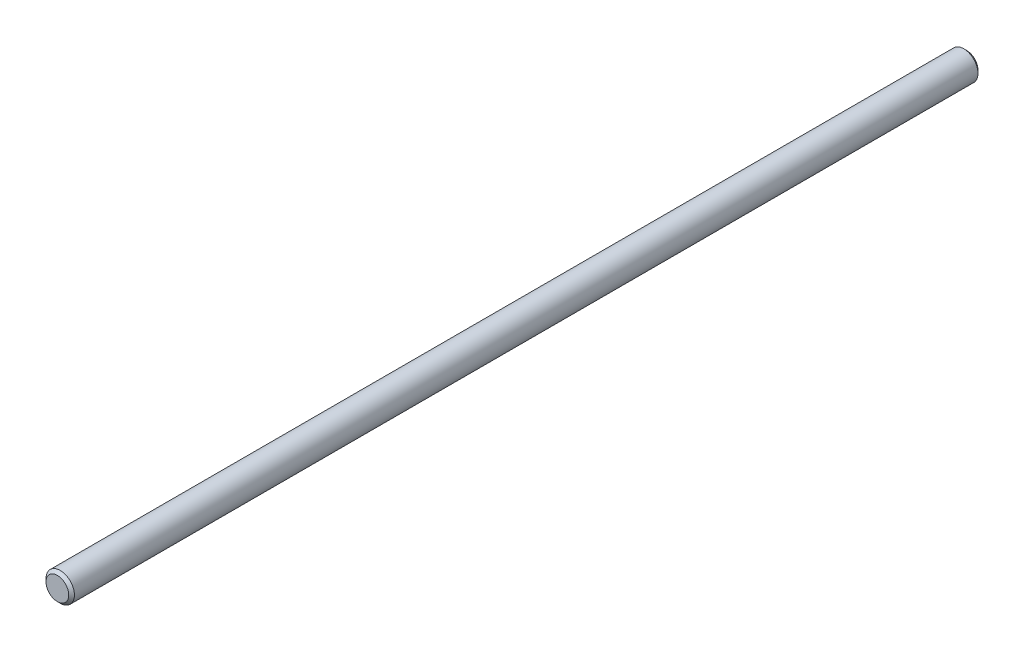
ISO-10303-21;
HEADER;
FILE_DESCRIPTION(('STEP AP214'),'2;1');
FILE_NAME('part.step','',(''),(''),'','','');
FILE_SCHEMA(('AUTOMOTIVE_DESIGN { 1 0 10303 214 1 1 1 1 }'));
ENDSEC;
DATA;
#1=APPLICATION_CONTEXT('core data for automotive mechanical design processes');
#2=APPLICATION_PROTOCOL_DEFINITION('international standard','automotive_design',2000,#1);
#3=PRODUCT_CONTEXT('',#1,'mechanical');
#4=PRODUCT('Part','Part','',(#3));
#5=PRODUCT_RELATED_PRODUCT_CATEGORY('part','',(#4));
#6=PRODUCT_DEFINITION_FORMATION('','',#4);
#7=PRODUCT_DEFINITION_CONTEXT('part definition',#1,'design');
#8=PRODUCT_DEFINITION('design','',#6,#7);
#9=PRODUCT_DEFINITION_SHAPE('','',#8);
#10=(LENGTH_UNIT() NAMED_UNIT(*) SI_UNIT(.MILLI.,.METRE.));
#11=(NAMED_UNIT(*) PLANE_ANGLE_UNIT() SI_UNIT($,.RADIAN.));
#12=(NAMED_UNIT(*) SI_UNIT($,.STERADIAN.) SOLID_ANGLE_UNIT());
#13=UNCERTAINTY_MEASURE_WITH_UNIT(LENGTH_MEASURE(1.E-05),#10,'distance_accuracy_value','');
#14=(GEOMETRIC_REPRESENTATION_CONTEXT(3) GLOBAL_UNCERTAINTY_ASSIGNED_CONTEXT((#13)) GLOBAL_UNIT_ASSIGNED_CONTEXT((#10,
#11,#12)) REPRESENTATION_CONTEXT('',''));
#15=CARTESIAN_POINT('',(0.,0.,0.));
#16=DIRECTION('',(0.,0.,1.));
#17=DIRECTION('',(1.,0.,0.));
#18=AXIS2_PLACEMENT_3D('',#15,#16,#17);
#19=CARTESIAN_POINT('',(0.,0.,152.4));
#20=DIRECTION('',(0.,0.,-1.));
#21=DIRECTION('',(-1.,0.,0.));
#22=AXIS2_PLACEMENT_3D('',#19,#20,#21);
#23=CYLINDRICAL_SURFACE('',#22,4.7625);
#24=CARTESIAN_POINT('',(0.,0.,-151.4475));
#25=DIRECTION('',(0.,0.,1.));
#26=DIRECTION('',(1.,0.,0.));
#27=AXIS2_PLACEMENT_3D('',#24,#25,#26);
#28=CIRCLE('',#27,4.7625);
#29=CARTESIAN_POINT('',(-4.7625,0.,-151.4475));
#30=VERTEX_POINT('',#29);
#31=EDGE_CURVE('E41',#30,#30,#28,.T.);
#32=CARTESIAN_POINT('',(0.,0.,151.4475));
#33=DIRECTION('',(0.,0.,1.));
#34=DIRECTION('',(1.,0.,0.));
#35=AXIS2_PLACEMENT_3D('',#32,#33,#34);
#36=CIRCLE('',#35,4.7625);
#37=CARTESIAN_POINT('',(-4.7625,0.,151.4475));
#38=VERTEX_POINT('',#37);
#39=EDGE_CURVE('E45',#38,#38,#36,.F.);
#40=CARTESIAN_POINT('',(-4.7625,0.,-151.4475));
#41=CARTESIAN_POINT('',(-4.7625,0.,-148.29234375));
#42=CARTESIAN_POINT('',(-4.7625,0.,-145.1371875));
#43=CARTESIAN_POINT('',(-4.7625,0.,-138.826875));
#44=CARTESIAN_POINT('',(-4.7625,0.,-135.67171875));
#45=CARTESIAN_POINT('',(-4.7625,0.,-129.36140625));
#46=CARTESIAN_POINT('',(-4.7625,0.,-126.20625));
#47=CARTESIAN_POINT('',(-4.7625,0.,-119.8959375));
#48=CARTESIAN_POINT('',(-4.7625,0.,-116.74078125));
#49=CARTESIAN_POINT('',(-4.7625,0.,-110.43046875));
#50=CARTESIAN_POINT('',(-4.7625,0.,-107.2753125));
#51=CARTESIAN_POINT('',(-4.7625,0.,-100.965));
#52=CARTESIAN_POINT('',(-4.7625,0.,-97.8098437499998));
#53=CARTESIAN_POINT('',(-4.7625,0.,-91.4995312499998));
#54=CARTESIAN_POINT('',(-4.7625,0.,-88.3443749999998));
#55=CARTESIAN_POINT('',(-4.7625,0.,-82.0340624999998));
#56=CARTESIAN_POINT('',(-4.7625,0.,-78.8789062499998));
#57=CARTESIAN_POINT('',(-4.7625,0.,-72.5685937499998));
#58=CARTESIAN_POINT('',(-4.7625,0.,-69.4134374999998));
#59=CARTESIAN_POINT('',(-4.7625,0.,-63.1031249999998));
#60=CARTESIAN_POINT('',(-4.7625,0.,-59.9479687499998));
#61=CARTESIAN_POINT('',(-4.7625,0.,-53.6376562499998));
#62=CARTESIAN_POINT('',(-4.7625,0.,-50.4824999999998));
#63=CARTESIAN_POINT('',(-4.7625,0.,-44.1721874999998));
#64=CARTESIAN_POINT('',(-4.7625,0.,-41.0170312499998));
#65=CARTESIAN_POINT('',(-4.7625,0.,-34.7067187499998));
#66=CARTESIAN_POINT('',(-4.7625,0.,-31.5515624999998));
#67=CARTESIAN_POINT('',(-4.7625,0.,-25.2412499999998));
#68=CARTESIAN_POINT('',(-4.7625,0.,-22.0860937499998));
#69=CARTESIAN_POINT('',(-4.7625,0.,-15.7757812499998));
#70=CARTESIAN_POINT('',(-4.7625,0.,-12.6206249999998));
#71=CARTESIAN_POINT('',(-4.7625,0.,-6.31031249999982));
#72=CARTESIAN_POINT('',(-4.7625,0.,-3.15515624999983));
#73=CARTESIAN_POINT('',(-4.7625,0.,3.15515625000016));
#74=CARTESIAN_POINT('',(-4.7625,0.,6.31031250000016));
#75=CARTESIAN_POINT('',(-4.7625,0.,12.6206250000002));
#76=CARTESIAN_POINT('',(-4.7625,0.,15.7757812500002));
#77=CARTESIAN_POINT('',(-4.7625,0.,22.0860937500002));
#78=CARTESIAN_POINT('',(-4.7625,0.,25.2412500000002));
#79=CARTESIAN_POINT('',(-4.7625,0.,31.5515625000002));
#80=CARTESIAN_POINT('',(-4.7625,0.,34.7067187500001));
#81=CARTESIAN_POINT('',(-4.7625,0.,41.0170312500001));
#82=CARTESIAN_POINT('',(-4.7625,0.,44.1721875000001));
#83=CARTESIAN_POINT('',(-4.7625,0.,50.4825000000001));
#84=CARTESIAN_POINT('',(-4.7625,0.,53.6376562500001));
#85=CARTESIAN_POINT('',(-4.7625,0.,59.9479687500001));
#86=CARTESIAN_POINT('',(-4.7625,0.,63.1031250000001));
#87=CARTESIAN_POINT('',(-4.7625,0.,69.4134375000001));
#88=CARTESIAN_POINT('',(-4.7625,0.,72.5685937500001));
#89=CARTESIAN_POINT('',(-4.7625,0.,78.8789062500001));
#90=CARTESIAN_POINT('',(-4.7625,0.,82.0340625000001));
#91=CARTESIAN_POINT('',(-4.7625,0.,88.3443750000001));
#92=CARTESIAN_POINT('',(-4.7625,0.,91.4995312500001));
#93=CARTESIAN_POINT('',(-4.7625,0.,97.8098437500001));
#94=CARTESIAN_POINT('',(-4.7625,0.,100.965));
#95=CARTESIAN_POINT('',(-4.7625,0.,107.2753125));
#96=CARTESIAN_POINT('',(-4.7625,0.,110.43046875));
#97=CARTESIAN_POINT('',(-4.7625,0.,116.74078125));
#98=CARTESIAN_POINT('',(-4.7625,0.,119.8959375));
#99=CARTESIAN_POINT('',(-4.7625,0.,126.20625));
#100=CARTESIAN_POINT('',(-4.7625,0.,129.36140625));
#101=CARTESIAN_POINT('',(-4.7625,0.,135.67171875));
#102=CARTESIAN_POINT('',(-4.7625,0.,138.826875));
#103=CARTESIAN_POINT('',(-4.7625,0.,145.1371875));
#104=CARTESIAN_POINT('',(-4.7625,0.,148.29234375));
#105=CARTESIAN_POINT('',(-4.7625,0.,151.4475));
#106=B_SPLINE_CURVE_WITH_KNOTS('',3,(#40,#41,#42,#43,#44,#45,#46,#47,#48,#49,#50,#51,#52,#53,
#54,#55,#56,#57,#58,#59,#60,#61,#62,#63,#64,#65,#66,#67,#68,#69,#70,#71,#72,#73,#74,#75,#76,#77,
#78,#79,#80,#81,#82,#83,#84,#85,#86,#87,#88,#89,#90,#91,#92,#93,#94,#95,#96,#97,#98,#99,#100,
#101,#102,#103,#104,#105),.UNSPECIFIED.,.F.,.F.,(4,2,2,2,2,2,2,2,2,2,2,2,2,2,2,2,2,2,2,2,2,2,2,
2,2,2,2,2,2,2,2,2,4),(0.,9.46546874999998,18.9309375,28.39640625,37.861875,47.32734375,
56.7928125,66.25828125,75.72375,85.1892187499999,94.6546875,104.12015625,113.585625,
123.05109375,132.5165625,141.98203125,151.4475,160.91296875,170.3784375,179.84390625,189.309375,
198.77484375,208.2403125,217.70578125,227.17125,236.63671875,246.1021875,255.56765625,
265.033125,274.49859375,283.9640625,293.42953125,302.895),.UNSPECIFIED.);
#107=EDGE_CURVE('BSEAM30',#30,#38,#106,.T.);
#108=ORIENTED_EDGE('',*,*,#31,.T.);
#109=ORIENTED_EDGE('',*,*,#39,.T.);
#110=ORIENTED_EDGE('',*,*,#107,.T.);
#111=ORIENTED_EDGE('',*,*,#107,.F.);
#112=EDGE_LOOP('',(#108,#110,#109,#111));
#113=FACE_BOUND('',#112,.T.);
#114=ADVANCED_FACE('F30',(#113),#23,.T.);
#115=CARTESIAN_POINT('',(0.,0.,152.4));
#116=DIRECTION('',(0.,0.,1.));
#117=DIRECTION('',(1.,0.,0.));
#118=AXIS2_PLACEMENT_3D('',#115,#116,#117);
#119=PLANE('',#118);
#120=CARTESIAN_POINT('',(0.,0.,152.4));
#121=DIRECTION('',(0.,0.,1.));
#122=DIRECTION('',(1.,0.,0.));
#123=AXIS2_PLACEMENT_3D('',#120,#121,#122);
#124=CIRCLE('',#123,3.81000000000012);
#125=CARTESIAN_POINT('',(3.81000000000012,0.,152.4));
#126=VERTEX_POINT('',#125);
#127=EDGE_CURVE('E10',#126,#126,#124,.T.);
#128=ORIENTED_EDGE('',*,*,#127,.T.);
#129=EDGE_LOOP('',(#128));
#130=FACE_BOUND('',#129,.T.);
#131=ADVANCED_FACE('F61',(#130),#119,.T.);
#132=CARTESIAN_POINT('',(0.,0.,-152.4));
#133=DIRECTION('',(0.,0.,1.));
#134=DIRECTION('',(1.,0.,0.));
#135=AXIS2_PLACEMENT_3D('',#132,#133,#134);
#136=PLANE('',#135);
#137=CARTESIAN_POINT('',(0.,0.,-152.4));
#138=DIRECTION('',(0.,0.,1.));
#139=DIRECTION('',(1.,0.,0.));
#140=AXIS2_PLACEMENT_3D('',#137,#138,#139);
#141=CIRCLE('',#140,3.8099999999997);
#142=CARTESIAN_POINT('',(3.8099999999997,0.,-152.4));
#143=VERTEX_POINT('',#142);
#144=EDGE_CURVE('E37',#143,#143,#141,.F.);
#145=ORIENTED_EDGE('',*,*,#144,.T.);
#146=EDGE_LOOP('',(#145));
#147=FACE_BOUND('',#146,.T.);
#148=ADVANCED_FACE('F58',(#147),#136,.F.);
#149=CARTESIAN_POINT('',(0.,0.,-151.4475));
#150=DIRECTION('',(0.,0.,1.));
#151=DIRECTION('',(1.,0.,0.));
#152=AXIS2_PLACEMENT_3D('',#149,#150,#151);
#153=CONICAL_SURFACE('',#152,4.7625,0.785398163397447);
#154=ORIENTED_EDGE('',*,*,#144,.F.);
#155=EDGE_LOOP('',(#154));
#156=FACE_BOUND('',#155,.T.);
#157=ORIENTED_EDGE('',*,*,#31,.F.);
#158=EDGE_LOOP('',(#157));
#159=FACE_BOUND('',#158,.T.);
#160=ADVANCED_FACE('F54',(#156,#159),#153,.T.);
#161=CARTESIAN_POINT('',(0.,0.,152.4));
#162=DIRECTION('',(0.,0.,-1.));
#163=DIRECTION('',(-1.,0.,0.));
#164=AXIS2_PLACEMENT_3D('',#161,#162,#163);
#165=CONICAL_SURFACE('',#164,3.81000000000012,0.785398163397447);
#166=ORIENTED_EDGE('',*,*,#39,.F.);
#167=EDGE_LOOP('',(#166));
#168=FACE_BOUND('',#167,.T.);
#169=ORIENTED_EDGE('',*,*,#127,.F.);
#170=EDGE_LOOP('',(#169));
#171=FACE_BOUND('',#170,.T.);
#172=ADVANCED_FACE('F32',(#168,#171),#165,.T.);
#173=CLOSED_SHELL('',(#114,#131,#148,#160,#172));
#174=MANIFOLD_SOLID_BREP('B2',#173);
#175=ADVANCED_BREP_SHAPE_REPRESENTATION('',(#18,#174),#14);
#176=SHAPE_DEFINITION_REPRESENTATION(#9,#175);
ENDSEC;
END-ISO-10303-21;
